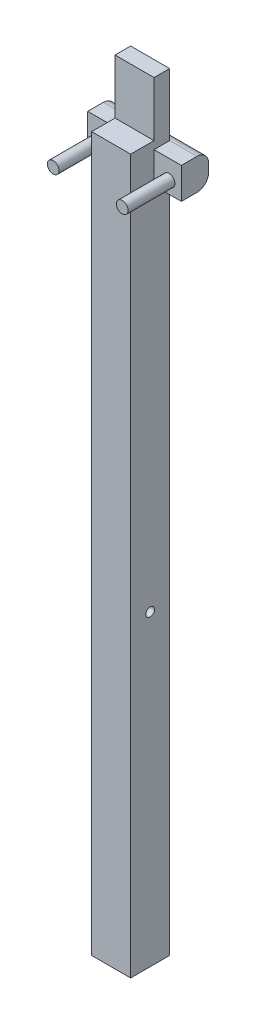
ISO-10303-21;
HEADER;
FILE_DESCRIPTION(('STEP AP214'),'2;1');
FILE_NAME('part.step','',(''),(''),'','','');
FILE_SCHEMA(('AUTOMOTIVE_DESIGN { 1 0 10303 214 1 1 1 1 }'));
ENDSEC;
DATA;
#1=APPLICATION_CONTEXT('core data for automotive mechanical design processes');
#2=APPLICATION_PROTOCOL_DEFINITION('international standard','automotive_design',2000,#1);
#3=PRODUCT_CONTEXT('',#1,'mechanical');
#4=PRODUCT('Part','Part','',(#3));
#5=PRODUCT_RELATED_PRODUCT_CATEGORY('part','',(#4));
#6=PRODUCT_DEFINITION_FORMATION('','',#4);
#7=PRODUCT_DEFINITION_CONTEXT('part definition',#1,'design');
#8=PRODUCT_DEFINITION('design','',#6,#7);
#9=PRODUCT_DEFINITION_SHAPE('','',#8);
#10=(LENGTH_UNIT() NAMED_UNIT(*) SI_UNIT(.MILLI.,.METRE.));
#11=(NAMED_UNIT(*) PLANE_ANGLE_UNIT() SI_UNIT($,.RADIAN.));
#12=(NAMED_UNIT(*) SI_UNIT($,.STERADIAN.) SOLID_ANGLE_UNIT());
#13=UNCERTAINTY_MEASURE_WITH_UNIT(LENGTH_MEASURE(1.E-05),#10,'distance_accuracy_value','');
#14=(GEOMETRIC_REPRESENTATION_CONTEXT(3) GLOBAL_UNCERTAINTY_ASSIGNED_CONTEXT((#13)) GLOBAL_UNIT_ASSIGNED_CONTEXT((#10,
#11,#12)) REPRESENTATION_CONTEXT('',''));
#15=CARTESIAN_POINT('',(0.,0.,0.));
#16=DIRECTION('',(0.,0.,1.));
#17=DIRECTION('',(1.,0.,0.));
#18=AXIS2_PLACEMENT_3D('',#15,#16,#17);
#19=CARTESIAN_POINT('',(-304.8,2093.6,0.));
#20=DIRECTION('',(0.,1.,0.));
#21=DIRECTION('',(0.,0.,1.));
#22=AXIS2_PLACEMENT_3D('',#19,#20,#21);
#23=PLANE('',#22);
#24=DIRECTION('',(0.,0.,1.));
#25=VECTOR('',#24,1.);
#26=CARTESIAN_POINT('',(304.8,2093.6,0.));
#27=LINE('',#26,#25);
#28=CARTESIAN_POINT('',(304.8,2093.6,0.));
#29=VERTEX_POINT('',#28);
#30=CARTESIAN_POINT('',(304.8,2093.6,101.6));
#31=VERTEX_POINT('',#30);
#32=EDGE_CURVE('E231',#29,#31,#27,.T.);
#33=ORIENTED_EDGE('',*,*,#32,.F.);
#34=DIRECTION('',(-1.,0.,0.));
#35=VECTOR('',#34,1.);
#36=CARTESIAN_POINT('',(-304.8,2093.6,0.));
#37=LINE('',#36,#35);
#38=CARTESIAN_POINT('',(127.,2093.6,0.));
#39=VERTEX_POINT('',#38);
#40=EDGE_CURVE('E11',#29,#39,#37,.T.);
#41=ORIENTED_EDGE('',*,*,#40,.T.);
#42=DIRECTION('',(0.,0.,-1.));
#43=VECTOR('',#42,1.);
#44=CARTESIAN_POINT('',(127.,2093.6,254.));
#45=LINE('',#44,#43);
#46=CARTESIAN_POINT('',(127.,2093.6,101.6));
#47=VERTEX_POINT('',#46);
#48=EDGE_CURVE('E315',#47,#39,#45,.T.);
#49=ORIENTED_EDGE('',*,*,#48,.F.);
#50=DIRECTION('',(-1.,0.,0.));
#51=VECTOR('',#50,1.);
#52=CARTESIAN_POINT('',(-304.8,2093.6,101.6));
#53=LINE('',#52,#51);
#54=EDGE_CURVE('E333',#31,#47,#53,.T.);
#55=ORIENTED_EDGE('',*,*,#54,.F.);
#56=EDGE_LOOP('',(#33,#41,#49,#55));
#57=FACE_BOUND('',#56,.T.);
#58=ADVANCED_FACE('F39',(#57),#23,.T.);
#59=CARTESIAN_POINT('',(-304.8,1890.4,0.));
#60=DIRECTION('',(0.,-1.,0.));
#61=DIRECTION('',(1.,0.,0.));
#62=AXIS2_PLACEMENT_3D('',#59,#60,#61);
#63=PLANE('',#62);
#64=DIRECTION('',(0.,0.,1.));
#65=VECTOR('',#64,1.);
#66=CARTESIAN_POINT('',(-304.8,1890.4,0.));
#67=LINE('',#66,#65);
#68=CARTESIAN_POINT('',(-304.8,1890.4,0.));
#69=VERTEX_POINT('',#68);
#70=CARTESIAN_POINT('',(-304.8,1890.4,101.6));
#71=VERTEX_POINT('',#70);
#72=EDGE_CURVE('E230',#69,#71,#67,.T.);
#73=ORIENTED_EDGE('',*,*,#72,.F.);
#74=DIRECTION('',(-1.,0.,0.));
#75=VECTOR('',#74,1.);
#76=CARTESIAN_POINT('',(-304.8,1890.4,0.));
#77=LINE('',#76,#75);
#78=CARTESIAN_POINT('',(-127.,1890.4,0.));
#79=VERTEX_POINT('',#78);
#80=EDGE_CURVE('E195',#69,#79,#77,.F.);
#81=ORIENTED_EDGE('',*,*,#80,.T.);
#82=DIRECTION('',(0.,0.,-1.));
#83=VECTOR('',#82,1.);
#84=CARTESIAN_POINT('',(-127.,1890.4,254.));
#85=LINE('',#84,#83);
#86=CARTESIAN_POINT('',(-127.,1890.4,101.6));
#87=VERTEX_POINT('',#86);
#88=EDGE_CURVE('E178',#87,#79,#85,.T.);
#89=ORIENTED_EDGE('',*,*,#88,.F.);
#90=DIRECTION('',(1.,0.,0.));
#91=VECTOR('',#90,1.);
#92=CARTESIAN_POINT('',(-304.8,1890.4,101.6));
#93=LINE('',#92,#91);
#94=EDGE_CURVE('E323',#71,#87,#93,.T.);
#95=ORIENTED_EDGE('',*,*,#94,.F.);
#96=EDGE_LOOP('',(#73,#81,#89,#95));
#97=FACE_BOUND('',#96,.T.);
#98=ADVANCED_FACE('F429',(#97),#63,.T.);
#99=CARTESIAN_POINT('',(0.,0.,0.));
#100=DIRECTION('',(0.,0.,-1.));
#101=DIRECTION('',(-1.,0.,0.));
#102=AXIS2_PLACEMENT_3D('',#99,#100,#101);
#103=PLANE('',#102);
#104=DIRECTION('',(0.,1.,0.));
#105=VECTOR('',#104,1.);
#106=CARTESIAN_POINT('',(127.,-2500.,0.));
#107=LINE('',#106,#105);
#108=CARTESIAN_POINT('',(127.,2500.,0.));
#109=VERTEX_POINT('',#108);
#110=EDGE_CURVE('E188',#39,#109,#107,.T.);
#111=ORIENTED_EDGE('',*,*,#110,.F.);
#112=DIRECTION('',(-1.,0.,0.));
#113=VECTOR('',#112,1.);
#114=CARTESIAN_POINT('',(304.8,2093.6,0.));
#115=LINE('',#114,#113);
#116=CARTESIAN_POINT('',(-127.,2093.6,0.));
#117=VERTEX_POINT('',#116);
#118=EDGE_CURVE('E166',#39,#117,#115,.T.);
#119=ORIENTED_EDGE('',*,*,#118,.T.);
#120=DIRECTION('',(0.,-1.,0.));
#121=VECTOR('',#120,1.);
#122=CARTESIAN_POINT('',(-127.,-2500.,0.));
#123=LINE('',#122,#121);
#124=CARTESIAN_POINT('',(-127.,2500.,0.));
#125=VERTEX_POINT('',#124);
#126=EDGE_CURVE('E264',#125,#117,#123,.T.);
#127=ORIENTED_EDGE('',*,*,#126,.F.);
#128=DIRECTION('',(-1.,0.,0.));
#129=VECTOR('',#128,1.);
#130=CARTESIAN_POINT('',(-127.,2500.,0.));
#131=LINE('',#130,#129);
#132=EDGE_CURVE('E187',#109,#125,#131,.T.);
#133=ORIENTED_EDGE('',*,*,#132,.F.);
#134=EDGE_LOOP('',(#111,#119,#127,#133));
#135=FACE_BOUND('',#134,.T.);
#136=ADVANCED_FACE('F389',(#135),#103,.T.);
#137=CARTESIAN_POINT('',(127.,-2500.,254.));
#138=DIRECTION('',(-1.,0.,0.));
#139=DIRECTION('',(0.,0.,1.));
#140=AXIS2_PLACEMENT_3D('',#137,#138,#139);
#141=PLANE('',#140);
#142=CARTESIAN_POINT('',(127.,-2500.,0.));
#143=VERTEX_POINT('',#142);
#144=CARTESIAN_POINT('',(127.,1890.4,0.));
#145=VERTEX_POINT('',#144);
#146=EDGE_CURVE('E160',#143,#145,#107,.T.);
#147=ORIENTED_EDGE('',*,*,#146,.T.);
#148=DIRECTION('',(0.,0.,1.));
#149=VECTOR('',#148,1.);
#150=CARTESIAN_POINT('',(127.,1890.4,254.));
#151=LINE('',#150,#149);
#152=CARTESIAN_POINT('',(127.,1890.4,101.6));
#153=VERTEX_POINT('',#152);
#154=EDGE_CURVE('E170',#145,#153,#151,.T.);
#155=ORIENTED_EDGE('',*,*,#154,.T.);
#156=DIRECTION('',(0.,1.,0.));
#157=VECTOR('',#156,1.);
#158=CARTESIAN_POINT('',(127.,-2500.,101.6));
#159=LINE('',#158,#157);
#160=EDGE_CURVE('E177',#153,#47,#159,.T.);
#161=ORIENTED_EDGE('',*,*,#160,.T.);
#162=ORIENTED_EDGE('',*,*,#48,.T.);
#163=ORIENTED_EDGE('',*,*,#110,.T.);
#164=DIRECTION('',(0.,0.,-1.));
#165=VECTOR('',#164,1.);
#166=CARTESIAN_POINT('',(127.,2500.,254.));
#167=LINE('',#166,#165);
#168=CARTESIAN_POINT('',(127.,2500.,101.6));
#169=VERTEX_POINT('',#168);
#170=EDGE_CURVE('E246',#169,#109,#167,.T.);
#171=ORIENTED_EDGE('',*,*,#170,.F.);
#172=DIRECTION('',(0.,1.,0.));
#173=VECTOR('',#172,1.);
#174=CARTESIAN_POINT('',(127.,2500.,101.6));
#175=LINE('',#174,#173);
#176=CARTESIAN_POINT('',(127.,2144.4,101.6));
#177=VERTEX_POINT('',#176);
#178=EDGE_CURVE('E300',#177,#169,#175,.T.);
#179=ORIENTED_EDGE('',*,*,#178,.F.);
#180=DIRECTION('',(0.,0.,1.));
#181=VECTOR('',#180,1.);
#182=CARTESIAN_POINT('',(127.,2144.4,101.6));
#183=LINE('',#182,#181);
#184=CARTESIAN_POINT('',(127.,2144.4,254.));
#185=VERTEX_POINT('',#184);
#186=EDGE_CURVE('E283',#177,#185,#183,.T.);
#187=ORIENTED_EDGE('',*,*,#186,.T.);
#188=DIRECTION('',(0.,1.,0.));
#189=VECTOR('',#188,1.);
#190=CARTESIAN_POINT('',(127.,-2500.,254.));
#191=LINE('',#190,#189);
#192=CARTESIAN_POINT('',(127.,-2500.,254.));
#193=VERTEX_POINT('',#192);
#194=EDGE_CURVE('E263',#193,#185,#191,.T.);
#195=ORIENTED_EDGE('',*,*,#194,.F.);
#196=DIRECTION('',(0.,0.,-1.));
#197=VECTOR('',#196,1.);
#198=CARTESIAN_POINT('',(127.,-2500.,254.));
#199=LINE('',#198,#197);
#200=EDGE_CURVE('E185',#193,#143,#199,.T.);
#201=ORIENTED_EDGE('',*,*,#200,.T.);
#202=EDGE_LOOP('',(#147,#155,#161,#162,#163,#171,#179,#187,#195,#201));
#203=FACE_BOUND('',#202,.T.);
#204=CARTESIAN_POINT('',(127.,-499.999999999997,127.));
#205=DIRECTION('',(1.,0.,0.));
#206=DIRECTION('',(0.,0.,-1.));
#207=AXIS2_PLACEMENT_3D('',#204,#205,#206);
#208=CIRCLE('',#207,28.575);
#209=CARTESIAN_POINT('',(127.,-499.999999999997,98.425));
#210=VERTEX_POINT('',#209);
#211=EDGE_CURVE('E278',#210,#210,#208,.T.);
#212=ORIENTED_EDGE('',*,*,#211,.F.);
#213=EDGE_LOOP('',(#212));
#214=FACE_BOUND('',#213,.T.);
#215=ADVANCED_FACE('F181',(#203,#214),#141,.F.);
#216=CARTESIAN_POINT('',(-127.,2500.,254.));
#217=DIRECTION('',(0.,-1.,0.));
#218=DIRECTION('',(0.,0.,-1.));
#219=AXIS2_PLACEMENT_3D('',#216,#217,#218);
#220=PLANE('',#219);
#221=DIRECTION('',(0.,0.,-1.));
#222=VECTOR('',#221,1.);
#223=CARTESIAN_POINT('',(-127.,2500.,254.));
#224=LINE('',#223,#222);
#225=CARTESIAN_POINT('',(-127.,2500.,101.6));
#226=VERTEX_POINT('',#225);
#227=EDGE_CURVE('E250',#226,#125,#224,.T.);
#228=ORIENTED_EDGE('',*,*,#227,.F.);
#229=DIRECTION('',(-1.,0.,0.));
#230=VECTOR('',#229,1.);
#231=CARTESIAN_POINT('',(-127.,2500.,101.6));
#232=LINE('',#231,#230);
#233=EDGE_CURVE('E290',#169,#226,#232,.T.);
#234=ORIENTED_EDGE('',*,*,#233,.F.);
#235=ORIENTED_EDGE('',*,*,#170,.T.);
#236=ORIENTED_EDGE('',*,*,#132,.T.);
#237=EDGE_LOOP('',(#228,#234,#235,#236));
#238=FACE_BOUND('',#237,.T.);
#239=ADVANCED_FACE('F403',(#238),#220,.F.);
#240=CARTESIAN_POINT('',(-127.,-2500.,254.));
#241=DIRECTION('',(1.,0.,0.));
#242=DIRECTION('',(0.,0.,-1.));
#243=AXIS2_PLACEMENT_3D('',#240,#241,#242);
#244=PLANE('',#243);
#245=CARTESIAN_POINT('',(-127.,-499.999999999997,127.));
#246=DIRECTION('',(1.,0.,0.));
#247=DIRECTION('',(0.,0.,-1.));
#248=AXIS2_PLACEMENT_3D('',#245,#246,#247);
#249=CIRCLE('',#248,28.575);
#250=CARTESIAN_POINT('',(-127.,-499.999999999997,98.425));
#251=VERTEX_POINT('',#250);
#252=EDGE_CURVE('E282',#251,#251,#249,.T.);
#253=ORIENTED_EDGE('',*,*,#252,.T.);
#254=EDGE_LOOP('',(#253));
#255=FACE_BOUND('',#254,.T.);
#256=DIRECTION('',(0.,-1.,0.));
#257=VECTOR('',#256,1.);
#258=CARTESIAN_POINT('',(-127.,-2500.,101.6));
#259=LINE('',#258,#257);
#260=CARTESIAN_POINT('',(-127.,2093.6,101.6));
#261=VERTEX_POINT('',#260);
#262=EDGE_CURVE('E242',#261,#87,#259,.T.);
#263=ORIENTED_EDGE('',*,*,#262,.T.);
#264=ORIENTED_EDGE('',*,*,#88,.T.);
#265=CARTESIAN_POINT('',(-127.,-2500.,0.));
#266=VERTEX_POINT('',#265);
#267=EDGE_CURVE('E161',#79,#266,#123,.T.);
#268=ORIENTED_EDGE('',*,*,#267,.T.);
#269=DIRECTION('',(0.,0.,-1.));
#270=VECTOR('',#269,1.);
#271=CARTESIAN_POINT('',(-127.,-2500.,254.));
#272=LINE('',#271,#270);
#273=CARTESIAN_POINT('',(-127.,-2500.,254.));
#274=VERTEX_POINT('',#273);
#275=EDGE_CURVE('E253',#274,#266,#272,.T.);
#276=ORIENTED_EDGE('',*,*,#275,.F.);
#277=DIRECTION('',(0.,-1.,0.));
#278=VECTOR('',#277,1.);
#279=CARTESIAN_POINT('',(-127.,-2500.,254.));
#280=LINE('',#279,#278);
#281=CARTESIAN_POINT('',(-127.,2144.4,254.));
#282=VERTEX_POINT('',#281);
#283=EDGE_CURVE('E272',#282,#274,#280,.T.);
#284=ORIENTED_EDGE('',*,*,#283,.F.);
#285=DIRECTION('',(0.,0.,1.));
#286=VECTOR('',#285,1.);
#287=CARTESIAN_POINT('',(-127.,2144.4,101.6));
#288=LINE('',#287,#286);
#289=CARTESIAN_POINT('',(-127.,2144.4,101.6));
#290=VERTEX_POINT('',#289);
#291=EDGE_CURVE('E287',#290,#282,#288,.T.);
#292=ORIENTED_EDGE('',*,*,#291,.F.);
#293=DIRECTION('',(0.,-1.,0.));
#294=VECTOR('',#293,1.);
#295=CARTESIAN_POINT('',(-127.,2144.4,101.6));
#296=LINE('',#295,#294);
#297=EDGE_CURVE('E297',#226,#290,#296,.T.);
#298=ORIENTED_EDGE('',*,*,#297,.F.);
#299=ORIENTED_EDGE('',*,*,#227,.T.);
#300=ORIENTED_EDGE('',*,*,#126,.T.);
#301=DIRECTION('',(0.,0.,1.));
#302=VECTOR('',#301,1.);
#303=CARTESIAN_POINT('',(-127.,2093.6,254.));
#304=LINE('',#303,#302);
#305=EDGE_CURVE('E218',#117,#261,#304,.T.);
#306=ORIENTED_EDGE('',*,*,#305,.T.);
#307=EDGE_LOOP('',(#263,#264,#268,#276,#284,#292,#298,#299,#300,#306));
#308=FACE_BOUND('',#307,.T.);
#309=ADVANCED_FACE('F397',(#255,#308),#244,.F.);
#310=CARTESIAN_POINT('',(-127.,-2500.,254.));
#311=DIRECTION('',(0.,1.,0.));
#312=DIRECTION('',(0.,0.,1.));
#313=AXIS2_PLACEMENT_3D('',#310,#311,#312);
#314=PLANE('',#313);
#315=DIRECTION('',(1.,0.,0.));
#316=VECTOR('',#315,1.);
#317=CARTESIAN_POINT('',(-127.,-2500.,0.));
#318=LINE('',#317,#316);
#319=EDGE_CURVE('E260',#266,#143,#318,.T.);
#320=ORIENTED_EDGE('',*,*,#319,.T.);
#321=ORIENTED_EDGE('',*,*,#200,.F.);
#322=DIRECTION('',(1.,0.,0.));
#323=VECTOR('',#322,1.);
#324=CARTESIAN_POINT('',(-127.,-2500.,254.));
#325=LINE('',#324,#323);
#326=EDGE_CURVE('E259',#274,#193,#325,.T.);
#327=ORIENTED_EDGE('',*,*,#326,.F.);
#328=ORIENTED_EDGE('',*,*,#275,.T.);
#329=EDGE_LOOP('',(#320,#321,#327,#328));
#330=FACE_BOUND('',#329,.T.);
#331=ADVANCED_FACE('F416',(#330),#314,.F.);
#332=CARTESIAN_POINT('',(0.,0.,254.));
#333=DIRECTION('',(0.,0.,-1.));
#334=DIRECTION('',(-1.,0.,0.));
#335=AXIS2_PLACEMENT_3D('',#332,#333,#334);
#336=PLANE('',#335);
#337=ORIENTED_EDGE('',*,*,#194,.T.);
#338=DIRECTION('',(1.,0.,0.));
#339=VECTOR('',#338,1.);
#340=CARTESIAN_POINT('',(-127.,2144.4,254.));
#341=LINE('',#340,#339);
#342=EDGE_CURVE('E294',#282,#185,#341,.T.);
#343=ORIENTED_EDGE('',*,*,#342,.F.);
#344=ORIENTED_EDGE('',*,*,#283,.T.);
#345=ORIENTED_EDGE('',*,*,#326,.T.);
#346=EDGE_LOOP('',(#337,#343,#344,#345));
#347=FACE_BOUND('',#346,.T.);
#348=ADVANCED_FACE('F412',(#347),#336,.F.);
#349=DIRECTION('',(-1.,0.,0.));
#350=VECTOR('',#349,1.);
#351=CARTESIAN_POINT('',(304.8,1890.4,0.));
#352=LINE('',#351,#350);
#353=EDGE_CURVE('E156',#145,#79,#352,.T.);
#354=ORIENTED_EDGE('',*,*,#353,.F.);
#355=ORIENTED_EDGE('',*,*,#146,.F.);
#356=ORIENTED_EDGE('',*,*,#319,.F.);
#357=ORIENTED_EDGE('',*,*,#267,.F.);
#358=EDGE_LOOP('',(#354,#355,#356,#357));
#359=FACE_BOUND('',#358,.T.);
#360=ADVANCED_FACE('F157',(#359),#103,.T.);
#361=CARTESIAN_POINT('',(-127.,-499.999999999997,127.));
#362=DIRECTION('',(1.,0.,0.));
#363=DIRECTION('',(0.,0.,-1.));
#364=AXIS2_PLACEMENT_3D('',#361,#362,#363);
#365=CYLINDRICAL_SURFACE('',#364,28.575);
#366=ORIENTED_EDGE('',*,*,#252,.F.);
#367=EDGE_LOOP('',(#366));
#368=FACE_BOUND('',#367,.T.);
#369=ORIENTED_EDGE('',*,*,#211,.T.);
#370=EDGE_LOOP('',(#369));
#371=FACE_BOUND('',#370,.T.);
#372=ADVANCED_FACE('F460',(#368,#371),#365,.F.);
#373=CARTESIAN_POINT('',(-127.,2144.4,101.6));
#374=DIRECTION('',(0.,-1.,0.));
#375=DIRECTION('',(1.,0.,0.));
#376=AXIS2_PLACEMENT_3D('',#373,#374,#375);
#377=PLANE('',#376);
#378=ORIENTED_EDGE('',*,*,#342,.T.);
#379=ORIENTED_EDGE('',*,*,#186,.F.);
#380=DIRECTION('',(1.,0.,0.));
#381=VECTOR('',#380,1.);
#382=CARTESIAN_POINT('',(-127.,2144.4,101.6));
#383=LINE('',#382,#381);
#384=EDGE_CURVE('E303',#290,#177,#383,.T.);
#385=ORIENTED_EDGE('',*,*,#384,.F.);
#386=ORIENTED_EDGE('',*,*,#291,.T.);
#387=EDGE_LOOP('',(#378,#379,#385,#386));
#388=FACE_BOUND('',#387,.T.);
#389=ADVANCED_FACE('F408',(#388),#377,.F.);
#390=CARTESIAN_POINT('',(0.,0.,101.6));
#391=DIRECTION('',(0.,0.,-1.));
#392=DIRECTION('',(-1.,0.,0.));
#393=AXIS2_PLACEMENT_3D('',#390,#391,#392);
#394=PLANE('',#393);
#395=ORIENTED_EDGE('',*,*,#297,.T.);
#396=ORIENTED_EDGE('',*,*,#384,.T.);
#397=ORIENTED_EDGE('',*,*,#178,.T.);
#398=ORIENTED_EDGE('',*,*,#233,.T.);
#399=EDGE_LOOP('',(#395,#396,#397,#398));
#400=FACE_BOUND('',#399,.T.);
#401=ADVANCED_FACE('F406',(#400),#394,.F.);
#402=CARTESIAN_POINT('',(-304.8,2093.6,0.));
#403=DIRECTION('',(-1.,0.,0.));
#404=DIRECTION('',(0.,-1.,0.));
#405=AXIS2_PLACEMENT_3D('',#402,#403,#404);
#406=PLANE('',#405);
#407=DIRECTION('',(0.,-1.,0.));
#408=VECTOR('',#407,1.);
#409=CARTESIAN_POINT('',(-304.8,2093.6,-76.2));
#410=LINE('',#409,#408);
#411=CARTESIAN_POINT('',(-304.8,2017.4,-76.2));
#412=VERTEX_POINT('',#411);
#413=CARTESIAN_POINT('',(-304.8,1966.6,-76.2));
#414=VERTEX_POINT('',#413);
#415=EDGE_CURVE('E344',#412,#414,#410,.T.);
#416=ORIENTED_EDGE('',*,*,#415,.T.);
#417=CARTESIAN_POINT('',(-304.8,1966.6,0.));
#418=DIRECTION('',(-1.,0.,0.));
#419=DIRECTION('',(0.,-1.,0.));
#420=AXIS2_PLACEMENT_3D('',#417,#418,#419);
#421=CIRCLE('',#420,76.2);
#422=EDGE_CURVE('E196',#414,#69,#421,.T.);
#423=ORIENTED_EDGE('',*,*,#422,.T.);
#424=ORIENTED_EDGE('',*,*,#72,.T.);
#425=DIRECTION('',(0.,-1.,0.));
#426=VECTOR('',#425,1.);
#427=CARTESIAN_POINT('',(-304.8,2093.6,101.6));
#428=LINE('',#427,#426);
#429=CARTESIAN_POINT('',(-304.8,2093.6,101.6));
#430=VERTEX_POINT('',#429);
#431=EDGE_CURVE('E228',#430,#71,#428,.T.);
#432=ORIENTED_EDGE('',*,*,#431,.F.);
#433=DIRECTION('',(0.,0.,1.));
#434=VECTOR('',#433,1.);
#435=CARTESIAN_POINT('',(-304.8,2093.6,0.));
#436=LINE('',#435,#434);
#437=CARTESIAN_POINT('',(-304.8,2093.6,0.));
#438=VERTEX_POINT('',#437);
#439=EDGE_CURVE('E215',#438,#430,#436,.T.);
#440=ORIENTED_EDGE('',*,*,#439,.F.);
#441=CARTESIAN_POINT('',(-304.8,2017.4,0.));
#442=DIRECTION('',(-1.,0.,0.));
#443=DIRECTION('',(0.,-1.,0.));
#444=AXIS2_PLACEMENT_3D('',#441,#442,#443);
#445=CIRCLE('',#444,76.2);
#446=EDGE_CURVE('E201',#438,#412,#445,.T.);
#447=ORIENTED_EDGE('',*,*,#446,.T.);
#448=EDGE_LOOP('',(#416,#423,#424,#432,#440,#447));
#449=FACE_BOUND('',#448,.T.);
#450=ADVANCED_FACE('F225',(#449),#406,.T.);
#451=CARTESIAN_POINT('',(0.,0.,101.6));
#452=DIRECTION('',(0.,0.,1.));
#453=DIRECTION('',(1.,0.,0.));
#454=AXIS2_PLACEMENT_3D('',#451,#452,#453);
#455=PLANE('',#454);
#456=CARTESIAN_POINT('',(-224.79,1970.41,101.6));
#457=DIRECTION('',(0.,0.,1.));
#458=DIRECTION('',(1.,0.,0.));
#459=AXIS2_PLACEMENT_3D('',#456,#457,#458);
#460=CIRCLE('',#459,38.1);
#461=CARTESIAN_POINT('',(-262.89,1970.41,101.6));
#462=VERTEX_POINT('',#461);
#463=EDGE_CURVE('E351',#462,#462,#460,.T.);
#464=ORIENTED_EDGE('',*,*,#463,.F.);
#465=EDGE_LOOP('',(#464));
#466=FACE_BOUND('',#465,.T.);
#467=ORIENTED_EDGE('',*,*,#262,.F.);
#468=EDGE_CURVE('E336',#261,#430,#53,.T.);
#469=ORIENTED_EDGE('',*,*,#468,.T.);
#470=ORIENTED_EDGE('',*,*,#431,.T.);
#471=ORIENTED_EDGE('',*,*,#94,.T.);
#472=EDGE_LOOP('',(#467,#469,#470,#471));
#473=FACE_BOUND('',#472,.T.);
#474=ADVANCED_FACE('F379',(#466,#473),#455,.T.);
#475=CARTESIAN_POINT('',(224.79,1970.41,101.6));
#476=DIRECTION('',(0.,0.,1.));
#477=DIRECTION('',(1.,0.,0.));
#478=AXIS2_PLACEMENT_3D('',#475,#476,#477);
#479=CIRCLE('',#478,38.1);
#480=CARTESIAN_POINT('',(186.69,1970.41,101.6));
#481=VERTEX_POINT('',#480);
#482=EDGE_CURVE('E359',#481,#481,#479,.T.);
#483=ORIENTED_EDGE('',*,*,#482,.F.);
#484=EDGE_LOOP('',(#483));
#485=FACE_BOUND('',#484,.T.);
#486=ORIENTED_EDGE('',*,*,#160,.F.);
#487=CARTESIAN_POINT('',(304.8,1890.4,101.6));
#488=VERTEX_POINT('',#487);
#489=EDGE_CURVE('E173',#153,#488,#93,.T.);
#490=ORIENTED_EDGE('',*,*,#489,.T.);
#491=DIRECTION('',(0.,1.,0.));
#492=VECTOR('',#491,1.);
#493=CARTESIAN_POINT('',(304.8,2093.6,101.6));
#494=LINE('',#493,#492);
#495=EDGE_CURVE('E337',#488,#31,#494,.T.);
#496=ORIENTED_EDGE('',*,*,#495,.T.);
#497=ORIENTED_EDGE('',*,*,#54,.T.);
#498=EDGE_LOOP('',(#486,#490,#496,#497));
#499=FACE_BOUND('',#498,.T.);
#500=ADVANCED_FACE('F376',(#485,#499),#455,.T.);
#501=ORIENTED_EDGE('',*,*,#154,.F.);
#502=DIRECTION('',(-1.,0.,0.));
#503=VECTOR('',#502,1.);
#504=CARTESIAN_POINT('',(-304.8,1890.4,0.));
#505=LINE('',#504,#503);
#506=CARTESIAN_POINT('',(304.8,1890.4,0.));
#507=VERTEX_POINT('',#506);
#508=EDGE_CURVE('E63',#145,#507,#505,.F.);
#509=ORIENTED_EDGE('',*,*,#508,.T.);
#510=DIRECTION('',(0.,0.,1.));
#511=VECTOR('',#510,1.);
#512=CARTESIAN_POINT('',(304.8,1890.4,0.));
#513=LINE('',#512,#511);
#514=EDGE_CURVE('E321',#507,#488,#513,.T.);
#515=ORIENTED_EDGE('',*,*,#514,.T.);
#516=ORIENTED_EDGE('',*,*,#489,.F.);
#517=EDGE_LOOP('',(#501,#509,#515,#516));
#518=FACE_BOUND('',#517,.T.);
#519=ADVANCED_FACE('F171',(#518),#63,.T.);
#520=ORIENTED_EDGE('',*,*,#305,.F.);
#521=DIRECTION('',(-1.,0.,0.));
#522=VECTOR('',#521,1.);
#523=CARTESIAN_POINT('',(-304.8,2093.6,0.));
#524=LINE('',#523,#522);
#525=EDGE_CURVE('E48',#117,#438,#524,.T.);
#526=ORIENTED_EDGE('',*,*,#525,.T.);
#527=ORIENTED_EDGE('',*,*,#439,.T.);
#528=ORIENTED_EDGE('',*,*,#468,.F.);
#529=EDGE_LOOP('',(#520,#526,#527,#528));
#530=FACE_BOUND('',#529,.T.);
#531=ADVANCED_FACE('F213',(#530),#23,.T.);
#532=CARTESIAN_POINT('',(304.8,2093.6,0.));
#533=DIRECTION('',(1.,0.,0.));
#534=DIRECTION('',(0.,1.,0.));
#535=AXIS2_PLACEMENT_3D('',#532,#533,#534);
#536=PLANE('',#535);
#537=ORIENTED_EDGE('',*,*,#514,.F.);
#538=CARTESIAN_POINT('',(304.8,1966.6,0.));
#539=DIRECTION('',(1.,0.,0.));
#540=DIRECTION('',(0.,1.,0.));
#541=AXIS2_PLACEMENT_3D('',#538,#539,#540);
#542=CIRCLE('',#541,76.2);
#543=CARTESIAN_POINT('',(304.8,1966.6,-76.2));
#544=VERTEX_POINT('',#543);
#545=EDGE_CURVE('E193',#507,#544,#542,.T.);
#546=ORIENTED_EDGE('',*,*,#545,.T.);
#547=DIRECTION('',(0.,-1.,0.));
#548=VECTOR('',#547,1.);
#549=CARTESIAN_POINT('',(304.8,2093.6,-76.2));
#550=LINE('',#549,#548);
#551=CARTESIAN_POINT('',(304.8,2017.4,-76.2));
#552=VERTEX_POINT('',#551);
#553=EDGE_CURVE('E341',#552,#544,#550,.T.);
#554=ORIENTED_EDGE('',*,*,#553,.F.);
#555=CARTESIAN_POINT('',(304.8,2017.4,0.));
#556=DIRECTION('',(1.,0.,0.));
#557=DIRECTION('',(0.,1.,0.));
#558=AXIS2_PLACEMENT_3D('',#555,#556,#557);
#559=CIRCLE('',#558,76.2);
#560=EDGE_CURVE('E55',#552,#29,#559,.T.);
#561=ORIENTED_EDGE('',*,*,#560,.T.);
#562=ORIENTED_EDGE('',*,*,#32,.T.);
#563=ORIENTED_EDGE('',*,*,#495,.F.);
#564=EDGE_LOOP('',(#537,#546,#554,#561,#562,#563));
#565=FACE_BOUND('',#564,.T.);
#566=ADVANCED_FACE('F440',(#565),#536,.T.);
#567=CARTESIAN_POINT('',(304.8,2093.6,-76.2));
#568=DIRECTION('',(0.,0.,-1.));
#569=DIRECTION('',(0.,1.,0.));
#570=AXIS2_PLACEMENT_3D('',#567,#568,#569);
#571=PLANE('',#570);
#572=ORIENTED_EDGE('',*,*,#553,.T.);
#573=DIRECTION('',(-1.,0.,0.));
#574=VECTOR('',#573,1.);
#575=CARTESIAN_POINT('',(304.8,1966.6,-76.2));
#576=LINE('',#575,#574);
#577=EDGE_CURVE('E235',#544,#414,#576,.T.);
#578=ORIENTED_EDGE('',*,*,#577,.T.);
#579=ORIENTED_EDGE('',*,*,#415,.F.);
#580=DIRECTION('',(-1.,0.,0.));
#581=VECTOR('',#580,1.);
#582=CARTESIAN_POINT('',(304.8,2017.4,-76.2));
#583=LINE('',#582,#581);
#584=EDGE_CURVE('E165',#412,#552,#583,.F.);
#585=ORIENTED_EDGE('',*,*,#584,.T.);
#586=EDGE_LOOP('',(#572,#578,#579,#585));
#587=FACE_BOUND('',#586,.T.);
#588=ADVANCED_FACE('F445',(#587),#571,.T.);
#589=CARTESIAN_POINT('',(304.8,1966.6,0.));
#590=DIRECTION('',(-1.,0.,0.));
#591=DIRECTION('',(0.,-1.,0.));
#592=AXIS2_PLACEMENT_3D('',#589,#590,#591);
#593=CYLINDRICAL_SURFACE('',#592,76.2);
#594=ORIENTED_EDGE('',*,*,#353,.T.);
#595=ORIENTED_EDGE('',*,*,#80,.F.);
#596=ORIENTED_EDGE('',*,*,#422,.F.);
#597=ORIENTED_EDGE('',*,*,#577,.F.);
#598=ORIENTED_EDGE('',*,*,#545,.F.);
#599=ORIENTED_EDGE('',*,*,#508,.F.);
#600=EDGE_LOOP('',(#594,#595,#596,#597,#598,#599));
#601=FACE_BOUND('',#600,.T.);
#602=ADVANCED_FACE('F191',(#601),#593,.T.);
#603=CARTESIAN_POINT('',(-304.8,2017.4,0.));
#604=DIRECTION('',(-1.,0.,0.));
#605=DIRECTION('',(0.,0.,1.));
#606=AXIS2_PLACEMENT_3D('',#603,#604,#605);
#607=CYLINDRICAL_SURFACE('',#606,76.2);
#608=ORIENTED_EDGE('',*,*,#560,.F.);
#609=ORIENTED_EDGE('',*,*,#584,.F.);
#610=ORIENTED_EDGE('',*,*,#446,.F.);
#611=ORIENTED_EDGE('',*,*,#525,.F.);
#612=ORIENTED_EDGE('',*,*,#118,.F.);
#613=ORIENTED_EDGE('',*,*,#40,.F.);
#614=EDGE_LOOP('',(#608,#609,#610,#611,#612,#613));
#615=FACE_BOUND('',#614,.T.);
#616=ADVANCED_FACE('F41',(#615),#607,.T.);
#617=CARTESIAN_POINT('',(-224.79,1970.41,406.4));
#618=DIRECTION('',(0.,0.,-1.));
#619=DIRECTION('',(-1.,0.,0.));
#620=AXIS2_PLACEMENT_3D('',#617,#618,#619);
#621=CYLINDRICAL_SURFACE('',#620,38.1);
#622=CARTESIAN_POINT('',(-224.79,1970.41,406.4));
#623=DIRECTION('',(0.,0.,1.));
#624=DIRECTION('',(1.,0.,0.));
#625=AXIS2_PLACEMENT_3D('',#622,#623,#624);
#626=CIRCLE('',#625,38.1);
#627=CARTESIAN_POINT('',(-262.89,1970.41,406.4));
#628=VERTEX_POINT('',#627);
#629=EDGE_CURVE('E347',#628,#628,#626,.T.);
#630=CARTESIAN_POINT('',(-262.89,1970.41,406.4));
#631=CARTESIAN_POINT('',(-262.89,1970.41,403.225));
#632=CARTESIAN_POINT('',(-262.89,1970.41,400.05));
#633=CARTESIAN_POINT('',(-262.89,1970.41,393.7));
#634=CARTESIAN_POINT('',(-262.89,1970.41,390.525));
#635=CARTESIAN_POINT('',(-262.89,1970.41,384.175));
#636=CARTESIAN_POINT('',(-262.89,1970.41,381.));
#637=CARTESIAN_POINT('',(-262.89,1970.41,374.65));
#638=CARTESIAN_POINT('',(-262.89,1970.41,371.475));
#639=CARTESIAN_POINT('',(-262.89,1970.41,365.125));
#640=CARTESIAN_POINT('',(-262.89,1970.41,361.95));
#641=CARTESIAN_POINT('',(-262.89,1970.41,355.6));
#642=CARTESIAN_POINT('',(-262.89,1970.41,352.425));
#643=CARTESIAN_POINT('',(-262.89,1970.41,346.075));
#644=CARTESIAN_POINT('',(-262.89,1970.41,342.9));
#645=CARTESIAN_POINT('',(-262.89,1970.41,336.55));
#646=CARTESIAN_POINT('',(-262.89,1970.41,333.375));
#647=CARTESIAN_POINT('',(-262.89,1970.41,327.025));
#648=CARTESIAN_POINT('',(-262.89,1970.41,323.85));
#649=CARTESIAN_POINT('',(-262.89,1970.41,317.5));
#650=CARTESIAN_POINT('',(-262.89,1970.41,314.325));
#651=CARTESIAN_POINT('',(-262.89,1970.41,307.975));
#652=CARTESIAN_POINT('',(-262.89,1970.41,304.8));
#653=CARTESIAN_POINT('',(-262.89,1970.41,298.45));
#654=CARTESIAN_POINT('',(-262.89,1970.41,295.275));
#655=CARTESIAN_POINT('',(-262.89,1970.41,288.925));
#656=CARTESIAN_POINT('',(-262.89,1970.41,285.75));
#657=CARTESIAN_POINT('',(-262.89,1970.41,279.4));
#658=CARTESIAN_POINT('',(-262.89,1970.41,276.225));
#659=CARTESIAN_POINT('',(-262.89,1970.41,269.875));
#660=CARTESIAN_POINT('',(-262.89,1970.41,266.7));
#661=CARTESIAN_POINT('',(-262.89,1970.41,260.35));
#662=CARTESIAN_POINT('',(-262.89,1970.41,257.175));
#663=CARTESIAN_POINT('',(-262.89,1970.41,250.825));
#664=CARTESIAN_POINT('',(-262.89,1970.41,247.65));
#665=CARTESIAN_POINT('',(-262.89,1970.41,241.3));
#666=CARTESIAN_POINT('',(-262.89,1970.41,238.125));
#667=CARTESIAN_POINT('',(-262.89,1970.41,231.775));
#668=CARTESIAN_POINT('',(-262.89,1970.41,228.6));
#669=CARTESIAN_POINT('',(-262.89,1970.41,222.25));
#670=CARTESIAN_POINT('',(-262.89,1970.41,219.075));
#671=CARTESIAN_POINT('',(-262.89,1970.41,212.725));
#672=CARTESIAN_POINT('',(-262.89,1970.41,209.55));
#673=CARTESIAN_POINT('',(-262.89,1970.41,203.2));
#674=CARTESIAN_POINT('',(-262.89,1970.41,200.025));
#675=CARTESIAN_POINT('',(-262.89,1970.41,193.675));
#676=CARTESIAN_POINT('',(-262.89,1970.41,190.5));
#677=CARTESIAN_POINT('',(-262.89,1970.41,184.15));
#678=CARTESIAN_POINT('',(-262.89,1970.41,180.975));
#679=CARTESIAN_POINT('',(-262.89,1970.41,174.625));
#680=CARTESIAN_POINT('',(-262.89,1970.41,171.45));
#681=CARTESIAN_POINT('',(-262.89,1970.41,165.1));
#682=CARTESIAN_POINT('',(-262.89,1970.41,161.925));
#683=CARTESIAN_POINT('',(-262.89,1970.41,155.575));
#684=CARTESIAN_POINT('',(-262.89,1970.41,152.4));
#685=CARTESIAN_POINT('',(-262.89,1970.41,146.05));
#686=CARTESIAN_POINT('',(-262.89,1970.41,142.875));
#687=CARTESIAN_POINT('',(-262.89,1970.41,136.525));
#688=CARTESIAN_POINT('',(-262.89,1970.41,133.35));
#689=CARTESIAN_POINT('',(-262.89,1970.41,127.));
#690=CARTESIAN_POINT('',(-262.89,1970.41,123.825));
#691=CARTESIAN_POINT('',(-262.89,1970.41,117.475));
#692=CARTESIAN_POINT('',(-262.89,1970.41,114.3));
#693=CARTESIAN_POINT('',(-262.89,1970.41,107.95));
#694=CARTESIAN_POINT('',(-262.89,1970.41,104.775));
#695=CARTESIAN_POINT('',(-262.89,1970.41,101.6));
#696=B_SPLINE_CURVE_WITH_KNOTS('',3,(#630,#631,#632,#633,#634,#635,#636,#637,#638,#639,#640,
#641,#642,#643,#644,#645,#646,#647,#648,#649,#650,#651,#652,#653,#654,#655,#656,#657,#658,#659,
#660,#661,#662,#663,#664,#665,#666,#667,#668,#669,#670,#671,#672,#673,#674,#675,#676,#677,#678,
#679,#680,#681,#682,#683,#684,#685,#686,#687,#688,#689,#690,#691,#692,#693,#694,#695),
.UNSPECIFIED.,.F.,.F.,(4,2,2,2,2,2,2,2,2,2,2,2,2,2,2,2,2,2,2,2,2,2,2,2,2,2,2,2,2,2,2,2,4),(0.,
9.52500000000001,19.05,28.575,38.1,47.625,57.15,66.675,76.2,85.7250000000001,95.2500000000001,
104.775,114.3,123.825,133.35,142.875,152.4,161.925,171.45,180.975,190.5,200.025,209.55,219.075,
228.6,238.125,247.65,257.175,266.7,276.225,285.75,295.275,304.8),.UNSPECIFIED.);
#697=EDGE_CURVE('BSEAM483',#628,#462,#696,.T.);
#698=ORIENTED_EDGE('',*,*,#629,.F.);
#699=ORIENTED_EDGE('',*,*,#463,.T.);
#700=ORIENTED_EDGE('',*,*,#697,.T.);
#701=ORIENTED_EDGE('',*,*,#697,.F.);
#702=EDGE_LOOP('',(#698,#700,#699,#701));
#703=FACE_BOUND('',#702,.T.);
#704=ADVANCED_FACE('F483',(#703),#621,.T.);
#705=CARTESIAN_POINT('',(-224.79,1970.41,406.4));
#706=DIRECTION('',(0.,0.,1.));
#707=DIRECTION('',(1.,0.,0.));
#708=AXIS2_PLACEMENT_3D('',#705,#706,#707);
#709=PLANE('',#708);
#710=ORIENTED_EDGE('',*,*,#629,.T.);
#711=EDGE_LOOP('',(#710));
#712=FACE_BOUND('',#711,.T.);
#713=ADVANCED_FACE('F372',(#712),#709,.T.);
#714=CARTESIAN_POINT('',(224.79,1970.41,406.4));
#715=DIRECTION('',(0.,0.,-1.));
#716=DIRECTION('',(-1.,0.,0.));
#717=AXIS2_PLACEMENT_3D('',#714,#715,#716);
#718=CYLINDRICAL_SURFACE('',#717,38.1);
#719=CARTESIAN_POINT('',(224.79,1970.41,406.4));
#720=DIRECTION('',(0.,0.,1.));
#721=DIRECTION('',(1.,0.,0.));
#722=AXIS2_PLACEMENT_3D('',#719,#720,#721);
#723=CIRCLE('',#722,38.1);
#724=CARTESIAN_POINT('',(186.69,1970.41,406.4));
#725=VERTEX_POINT('',#724);
#726=EDGE_CURVE('E355',#725,#725,#723,.T.);
#727=CARTESIAN_POINT('',(186.69,1970.41,406.4));
#728=CARTESIAN_POINT('',(186.69,1970.41,403.225));
#729=CARTESIAN_POINT('',(186.69,1970.41,400.05));
#730=CARTESIAN_POINT('',(186.69,1970.41,393.7));
#731=CARTESIAN_POINT('',(186.69,1970.41,390.525));
#732=CARTESIAN_POINT('',(186.69,1970.41,384.175));
#733=CARTESIAN_POINT('',(186.69,1970.41,381.));
#734=CARTESIAN_POINT('',(186.69,1970.41,374.65));
#735=CARTESIAN_POINT('',(186.69,1970.41,371.475));
#736=CARTESIAN_POINT('',(186.69,1970.41,365.125));
#737=CARTESIAN_POINT('',(186.69,1970.41,361.95));
#738=CARTESIAN_POINT('',(186.69,1970.41,355.6));
#739=CARTESIAN_POINT('',(186.69,1970.41,352.425));
#740=CARTESIAN_POINT('',(186.69,1970.41,346.075));
#741=CARTESIAN_POINT('',(186.69,1970.41,342.9));
#742=CARTESIAN_POINT('',(186.69,1970.41,336.55));
#743=CARTESIAN_POINT('',(186.69,1970.41,333.375));
#744=CARTESIAN_POINT('',(186.69,1970.41,327.025));
#745=CARTESIAN_POINT('',(186.69,1970.41,323.85));
#746=CARTESIAN_POINT('',(186.69,1970.41,317.5));
#747=CARTESIAN_POINT('',(186.69,1970.41,314.325));
#748=CARTESIAN_POINT('',(186.69,1970.41,307.975));
#749=CARTESIAN_POINT('',(186.69,1970.41,304.8));
#750=CARTESIAN_POINT('',(186.69,1970.41,298.45));
#751=CARTESIAN_POINT('',(186.69,1970.41,295.275));
#752=CARTESIAN_POINT('',(186.69,1970.41,288.925));
#753=CARTESIAN_POINT('',(186.69,1970.41,285.75));
#754=CARTESIAN_POINT('',(186.69,1970.41,279.4));
#755=CARTESIAN_POINT('',(186.69,1970.41,276.225));
#756=CARTESIAN_POINT('',(186.69,1970.41,269.875));
#757=CARTESIAN_POINT('',(186.69,1970.41,266.7));
#758=CARTESIAN_POINT('',(186.69,1970.41,260.35));
#759=CARTESIAN_POINT('',(186.69,1970.41,257.175));
#760=CARTESIAN_POINT('',(186.69,1970.41,250.825));
#761=CARTESIAN_POINT('',(186.69,1970.41,247.65));
#762=CARTESIAN_POINT('',(186.69,1970.41,241.3));
#763=CARTESIAN_POINT('',(186.69,1970.41,238.125));
#764=CARTESIAN_POINT('',(186.69,1970.41,231.775));
#765=CARTESIAN_POINT('',(186.69,1970.41,228.6));
#766=CARTESIAN_POINT('',(186.69,1970.41,222.25));
#767=CARTESIAN_POINT('',(186.69,1970.41,219.075));
#768=CARTESIAN_POINT('',(186.69,1970.41,212.725));
#769=CARTESIAN_POINT('',(186.69,1970.41,209.55));
#770=CARTESIAN_POINT('',(186.69,1970.41,203.2));
#771=CARTESIAN_POINT('',(186.69,1970.41,200.025));
#772=CARTESIAN_POINT('',(186.69,1970.41,193.675));
#773=CARTESIAN_POINT('',(186.69,1970.41,190.5));
#774=CARTESIAN_POINT('',(186.69,1970.41,184.15));
#775=CARTESIAN_POINT('',(186.69,1970.41,180.975));
#776=CARTESIAN_POINT('',(186.69,1970.41,174.625));
#777=CARTESIAN_POINT('',(186.69,1970.41,171.45));
#778=CARTESIAN_POINT('',(186.69,1970.41,165.1));
#779=CARTESIAN_POINT('',(186.69,1970.41,161.925));
#780=CARTESIAN_POINT('',(186.69,1970.41,155.575));
#781=CARTESIAN_POINT('',(186.69,1970.41,152.4));
#782=CARTESIAN_POINT('',(186.69,1970.41,146.05));
#783=CARTESIAN_POINT('',(186.69,1970.41,142.875));
#784=CARTESIAN_POINT('',(186.69,1970.41,136.525));
#785=CARTESIAN_POINT('',(186.69,1970.41,133.35));
#786=CARTESIAN_POINT('',(186.69,1970.41,127.));
#787=CARTESIAN_POINT('',(186.69,1970.41,123.825));
#788=CARTESIAN_POINT('',(186.69,1970.41,117.475));
#789=CARTESIAN_POINT('',(186.69,1970.41,114.3));
#790=CARTESIAN_POINT('',(186.69,1970.41,107.95));
#791=CARTESIAN_POINT('',(186.69,1970.41,104.775));
#792=CARTESIAN_POINT('',(186.69,1970.41,101.6));
#793=B_SPLINE_CURVE_WITH_KNOTS('',3,(#727,#728,#729,#730,#731,#732,#733,#734,#735,#736,#737,
#738,#739,#740,#741,#742,#743,#744,#745,#746,#747,#748,#749,#750,#751,#752,#753,#754,#755,#756,
#757,#758,#759,#760,#761,#762,#763,#764,#765,#766,#767,#768,#769,#770,#771,#772,#773,#774,#775,
#776,#777,#778,#779,#780,#781,#782,#783,#784,#785,#786,#787,#788,#789,#790,#791,#792),
.UNSPECIFIED.,.F.,.F.,(4,2,2,2,2,2,2,2,2,2,2,2,2,2,2,2,2,2,2,2,2,2,2,2,2,2,2,2,2,2,2,2,4),(0.,
9.52500000000001,19.05,28.575,38.1,47.625,57.15,66.675,76.2,85.7250000000001,95.2500000000001,
104.775,114.3,123.825,133.35,142.875,152.4,161.925,171.45,180.975,190.5,200.025,209.55,219.075,
228.6,238.125,247.65,257.175,266.7,276.225,285.75,295.275,304.8),.UNSPECIFIED.);
#794=EDGE_CURVE('BSEAM369',#725,#481,#793,.T.);
#795=ORIENTED_EDGE('',*,*,#726,.F.);
#796=ORIENTED_EDGE('',*,*,#482,.T.);
#797=ORIENTED_EDGE('',*,*,#794,.T.);
#798=ORIENTED_EDGE('',*,*,#794,.F.);
#799=EDGE_LOOP('',(#795,#797,#796,#798));
#800=FACE_BOUND('',#799,.T.);
#801=ADVANCED_FACE('F369',(#800),#718,.T.);
#802=CARTESIAN_POINT('',(224.79,1970.41,406.4));
#803=DIRECTION('',(0.,0.,1.));
#804=DIRECTION('',(1.,0.,0.));
#805=AXIS2_PLACEMENT_3D('',#802,#803,#804);
#806=PLANE('',#805);
#807=ORIENTED_EDGE('',*,*,#726,.T.);
#808=EDGE_LOOP('',(#807));
#809=FACE_BOUND('',#808,.T.);
#810=ADVANCED_FACE('F367',(#809),#806,.T.);
#811=CLOSED_SHELL('',(#58,#98,#136,#215,#239,#309,#331,#348,#360,#372,#389,#401,#450,#474,#500,
#519,#531,#566,#588,#602,#616,#704,#713,#801,#810));
#812=MANIFOLD_SOLID_BREP('B2',#811);
#813=ADVANCED_BREP_SHAPE_REPRESENTATION('',(#18,#812),#14);
#814=SHAPE_DEFINITION_REPRESENTATION(#9,#813);
ENDSEC;
END-ISO-10303-21;
